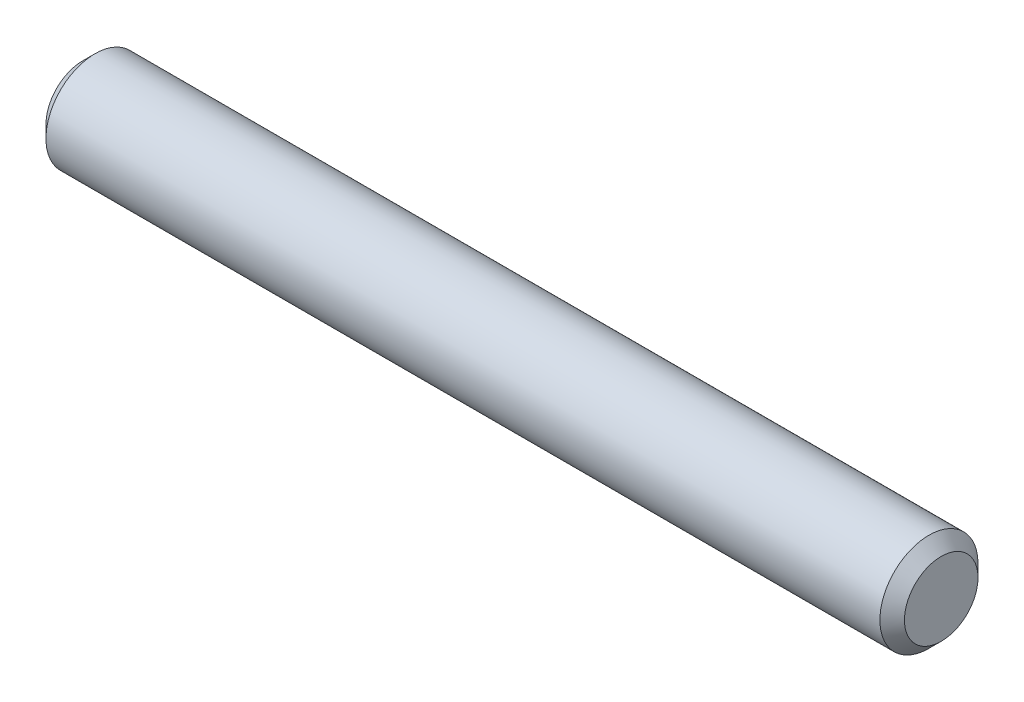
ISO-10303-21;
HEADER;
FILE_DESCRIPTION(('STEP AP214'),'2;1');
FILE_NAME('part.step','',(''),(''),'','','');
FILE_SCHEMA(('AUTOMOTIVE_DESIGN { 1 0 10303 214 1 1 1 1 }'));
ENDSEC;
DATA;
#1=APPLICATION_CONTEXT('core data for automotive mechanical design processes');
#2=APPLICATION_PROTOCOL_DEFINITION('international standard','automotive_design',2000,#1);
#3=PRODUCT_CONTEXT('',#1,'mechanical');
#4=PRODUCT('Part','Part','',(#3));
#5=PRODUCT_RELATED_PRODUCT_CATEGORY('part','',(#4));
#6=PRODUCT_DEFINITION_FORMATION('','',#4);
#7=PRODUCT_DEFINITION_CONTEXT('part definition',#1,'design');
#8=PRODUCT_DEFINITION('design','',#6,#7);
#9=PRODUCT_DEFINITION_SHAPE('','',#8);
#10=(LENGTH_UNIT() NAMED_UNIT(*) SI_UNIT(.MILLI.,.METRE.));
#11=(NAMED_UNIT(*) PLANE_ANGLE_UNIT() SI_UNIT($,.RADIAN.));
#12=(NAMED_UNIT(*) SI_UNIT($,.STERADIAN.) SOLID_ANGLE_UNIT());
#13=UNCERTAINTY_MEASURE_WITH_UNIT(LENGTH_MEASURE(1.E-05),#10,'distance_accuracy_value','');
#14=(GEOMETRIC_REPRESENTATION_CONTEXT(3) GLOBAL_UNCERTAINTY_ASSIGNED_CONTEXT((#13)) GLOBAL_UNIT_ASSIGNED_CONTEXT((#10,
#11,#12)) REPRESENTATION_CONTEXT('',''));
#15=CARTESIAN_POINT('',(0.,0.,0.));
#16=DIRECTION('',(0.,0.,1.));
#17=DIRECTION('',(1.,0.,0.));
#18=AXIS2_PLACEMENT_3D('',#15,#16,#17);
#19=CARTESIAN_POINT('',(70.,0.,0.));
#20=DIRECTION('',(-1.,0.,0.));
#21=DIRECTION('',(0.,0.,1.));
#22=AXIS2_PLACEMENT_3D('',#19,#20,#21);
#23=CYLINDRICAL_SURFACE('',#22,4.);
#24=CARTESIAN_POINT('',(69.,0.,0.));
#25=DIRECTION('',(1.,0.,0.));
#26=DIRECTION('',(0.,0.,-1.));
#27=AXIS2_PLACEMENT_3D('',#24,#25,#26);
#28=CIRCLE('',#27,4.);
#29=CARTESIAN_POINT('',(69.,0.,-4.));
#30=VERTEX_POINT('',#29);
#31=EDGE_CURVE('E48',#30,#30,#28,.F.);
#32=ORIENTED_EDGE('',*,*,#31,.T.);
#33=EDGE_LOOP('',(#32));
#34=FACE_BOUND('',#33,.T.);
#35=CARTESIAN_POINT('',(0.999999999999987,0.,0.));
#36=DIRECTION('',(1.,0.,0.));
#37=DIRECTION('',(0.,0.,-1.));
#38=AXIS2_PLACEMENT_3D('',#35,#36,#37);
#39=CIRCLE('',#38,4.);
#40=CARTESIAN_POINT('',(0.999999999999987,0.,-4.));
#41=VERTEX_POINT('',#40);
#42=EDGE_CURVE('E53',#41,#41,#39,.T.);
#43=ORIENTED_EDGE('',*,*,#42,.T.);
#44=EDGE_LOOP('',(#43));
#45=FACE_BOUND('',#44,.T.);
#46=ADVANCED_FACE('F39',(#34,#45),#23,.T.);
#47=CARTESIAN_POINT('',(70.,0.,0.));
#48=DIRECTION('',(1.,0.,0.));
#49=DIRECTION('',(0.,0.,-1.));
#50=AXIS2_PLACEMENT_3D('',#47,#48,#49);
#51=PLANE('',#50);
#52=CARTESIAN_POINT('',(70.,0.,0.));
#53=DIRECTION('',(1.,0.,0.));
#54=DIRECTION('',(0.,0.,-1.));
#55=AXIS2_PLACEMENT_3D('',#52,#53,#54);
#56=CIRCLE('',#55,3.);
#57=CARTESIAN_POINT('',(70.,0.,-3.));
#58=VERTEX_POINT('',#57);
#59=EDGE_CURVE('E58',#58,#58,#56,.T.);
#60=ORIENTED_EDGE('',*,*,#59,.T.);
#61=EDGE_LOOP('',(#60));
#62=FACE_BOUND('',#61,.T.);
#63=ADVANCED_FACE('F65',(#62),#51,.T.);
#64=CARTESIAN_POINT('',(0.,0.,0.));
#65=DIRECTION('',(1.,0.,0.));
#66=DIRECTION('',(0.,0.,-1.));
#67=AXIS2_PLACEMENT_3D('',#64,#65,#66);
#68=PLANE('',#67);
#69=CARTESIAN_POINT('',(0.,0.,0.));
#70=DIRECTION('',(1.,0.,0.));
#71=DIRECTION('',(0.,0.,-1.));
#72=AXIS2_PLACEMENT_3D('',#69,#70,#71);
#73=CIRCLE('',#72,3.00000000000001);
#74=CARTESIAN_POINT('',(0.,0.,-3.00000000000001));
#75=VERTEX_POINT('',#74);
#76=EDGE_CURVE('E10',#75,#75,#73,.F.);
#77=ORIENTED_EDGE('',*,*,#76,.T.);
#78=EDGE_LOOP('',(#77));
#79=FACE_BOUND('',#78,.T.);
#80=ADVANCED_FACE('F69',(#79),#68,.F.);
#81=CARTESIAN_POINT('',(70.,0.,0.));
#82=DIRECTION('',(-1.,0.,0.));
#83=DIRECTION('',(0.,0.,1.));
#84=AXIS2_PLACEMENT_3D('',#81,#82,#83);
#85=CONICAL_SURFACE('',#84,3.,0.785398163397443);
#86=ORIENTED_EDGE('',*,*,#31,.F.);
#87=EDGE_LOOP('',(#86));
#88=FACE_BOUND('',#87,.T.);
#89=ORIENTED_EDGE('',*,*,#59,.F.);
#90=EDGE_LOOP('',(#89));
#91=FACE_BOUND('',#90,.T.);
#92=ADVANCED_FACE('F67',(#88,#91),#85,.T.);
#93=CARTESIAN_POINT('',(0.999999999999987,0.,0.));
#94=DIRECTION('',(1.,0.,0.));
#95=DIRECTION('',(0.,0.,-1.));
#96=AXIS2_PLACEMENT_3D('',#93,#94,#95);
#97=CONICAL_SURFACE('',#96,4.,0.78539816339745);
#98=ORIENTED_EDGE('',*,*,#76,.F.);
#99=EDGE_LOOP('',(#98));
#100=FACE_BOUND('',#99,.T.);
#101=ORIENTED_EDGE('',*,*,#42,.F.);
#102=EDGE_LOOP('',(#101));
#103=FACE_BOUND('',#102,.T.);
#104=ADVANCED_FACE('F42',(#100,#103),#97,.T.);
#105=CLOSED_SHELL('',(#46,#63,#80,#92,#104));
#106=MANIFOLD_SOLID_BREP('B2',#105);
#107=ADVANCED_BREP_SHAPE_REPRESENTATION('',(#18,#106),#14);
#108=SHAPE_DEFINITION_REPRESENTATION(#9,#107);
ENDSEC;
END-ISO-10303-21;
